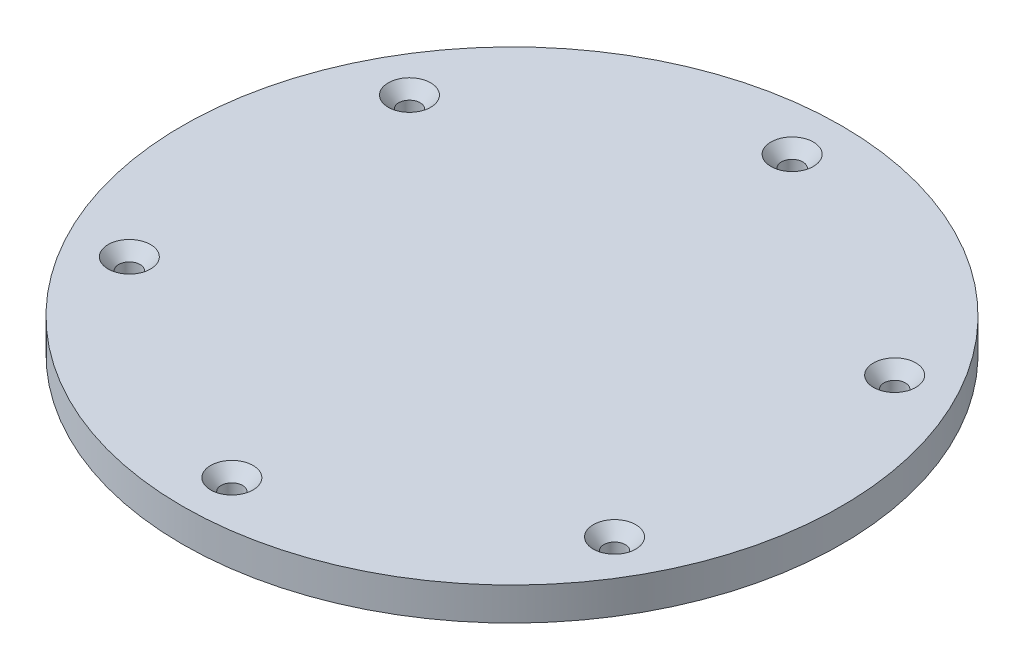
ISO-10303-21;
HEADER;
FILE_DESCRIPTION(('STEP AP214'),'2;1');
FILE_NAME('part.step','',(''),(''),'','','');
FILE_SCHEMA(('AUTOMOTIVE_DESIGN { 1 0 10303 214 1 1 1 1 }'));
ENDSEC;
DATA;
#1=APPLICATION_CONTEXT('core data for automotive mechanical design processes');
#2=APPLICATION_PROTOCOL_DEFINITION('international standard','automotive_design',2000,#1);
#3=PRODUCT_CONTEXT('',#1,'mechanical');
#4=PRODUCT('Part','Part','',(#3));
#5=PRODUCT_RELATED_PRODUCT_CATEGORY('part','',(#4));
#6=PRODUCT_DEFINITION_FORMATION('','',#4);
#7=PRODUCT_DEFINITION_CONTEXT('part definition',#1,'design');
#8=PRODUCT_DEFINITION('design','',#6,#7);
#9=PRODUCT_DEFINITION_SHAPE('','',#8);
#10=(LENGTH_UNIT() NAMED_UNIT(*) SI_UNIT(.MILLI.,.METRE.));
#11=(NAMED_UNIT(*) PLANE_ANGLE_UNIT() SI_UNIT($,.RADIAN.));
#12=(NAMED_UNIT(*) SI_UNIT($,.STERADIAN.) SOLID_ANGLE_UNIT());
#13=UNCERTAINTY_MEASURE_WITH_UNIT(LENGTH_MEASURE(1.E-05),#10,'distance_accuracy_value','');
#14=(GEOMETRIC_REPRESENTATION_CONTEXT(3) GLOBAL_UNCERTAINTY_ASSIGNED_CONTEXT((#13)) GLOBAL_UNIT_ASSIGNED_CONTEXT((#10,
#11,#12)) REPRESENTATION_CONTEXT('',''));
#15=CARTESIAN_POINT('',(0.,0.,0.));
#16=DIRECTION('',(0.,0.,1.));
#17=DIRECTION('',(1.,0.,0.));
#18=AXIS2_PLACEMENT_3D('',#15,#16,#17);
#19=CARTESIAN_POINT('',(0.,10.,0.));
#20=DIRECTION('',(0.,-1.,0.));
#21=DIRECTION('',(0.,0.,-1.));
#22=AXIS2_PLACEMENT_3D('',#19,#20,#21);
#23=CYLINDRICAL_SURFACE('',#22,100.);
#24=CARTESIAN_POINT('',(0.,10.,0.));
#25=DIRECTION('',(0.,1.,0.));
#26=DIRECTION('',(0.,0.,1.));
#27=AXIS2_PLACEMENT_3D('',#24,#25,#26);
#28=CIRCLE('',#27,100.);
#29=CARTESIAN_POINT('',(0.,10.,100.));
#30=VERTEX_POINT('',#29);
#31=EDGE_CURVE('E10',#30,#30,#28,.T.);
#32=ORIENTED_EDGE('',*,*,#31,.F.);
#33=EDGE_LOOP('',(#32));
#34=FACE_BOUND('',#33,.T.);
#35=CARTESIAN_POINT('',(0.,0.,0.));
#36=DIRECTION('',(0.,1.,0.));
#37=DIRECTION('',(0.,0.,1.));
#38=AXIS2_PLACEMENT_3D('',#35,#36,#37);
#39=CIRCLE('',#38,100.);
#40=CARTESIAN_POINT('',(0.,0.,100.));
#41=VERTEX_POINT('',#40);
#42=EDGE_CURVE('E34',#41,#41,#39,.T.);
#43=ORIENTED_EDGE('',*,*,#42,.T.);
#44=EDGE_LOOP('',(#43));
#45=FACE_BOUND('',#44,.T.);
#46=ADVANCED_FACE('F31',(#34,#45),#23,.T.);
#47=CARTESIAN_POINT('',(0.,10.,0.));
#48=DIRECTION('',(0.,1.,0.));
#49=DIRECTION('',(0.,0.,1.));
#50=AXIS2_PLACEMENT_3D('',#47,#48,#49);
#51=PLANE('',#50);
#52=CARTESIAN_POINT('',(-73.6121593216768,10.,-42.5000000000009));
#53=DIRECTION('',(0.,1.,0.));
#54=DIRECTION('',(0.,0.,1.));
#55=AXIS2_PLACEMENT_3D('',#52,#53,#54);
#56=CIRCLE('',#55,6.4389);
#57=CARTESIAN_POINT('',(-73.6121593216768,10.,-36.0611000000009));
#58=VERTEX_POINT('',#57);
#59=EDGE_CURVE('E93',#58,#58,#56,.T.);
#60=ORIENTED_EDGE('',*,*,#59,.F.);
#61=EDGE_LOOP('',(#60));
#62=FACE_BOUND('',#61,.T.);
#63=CARTESIAN_POINT('',(0.,10.,-85.));
#64=DIRECTION('',(0.,1.,0.));
#65=DIRECTION('',(0.,0.,1.));
#66=AXIS2_PLACEMENT_3D('',#63,#64,#65);
#67=CIRCLE('',#66,6.4389);
#68=CARTESIAN_POINT('',(0.,10.,-78.5611));
#69=VERTEX_POINT('',#68);
#70=EDGE_CURVE('E84',#69,#69,#67,.T.);
#71=ORIENTED_EDGE('',*,*,#70,.F.);
#72=EDGE_LOOP('',(#71));
#73=FACE_BOUND('',#72,.T.);
#74=CARTESIAN_POINT('',(73.6121593216774,10.,-42.4999999999998));
#75=DIRECTION('',(0.,1.,0.));
#76=DIRECTION('',(0.,0.,1.));
#77=AXIS2_PLACEMENT_3D('',#74,#75,#76);
#78=CIRCLE('',#77,6.4389);
#79=CARTESIAN_POINT('',(73.6121593216774,10.,-36.0610999999998));
#80=VERTEX_POINT('',#79);
#81=EDGE_CURVE('E75',#80,#80,#78,.T.);
#82=ORIENTED_EDGE('',*,*,#81,.F.);
#83=EDGE_LOOP('',(#82));
#84=FACE_BOUND('',#83,.T.);
#85=CARTESIAN_POINT('',(73.6121593216771,10.,42.5000000000003));
#86=DIRECTION('',(0.,1.,0.));
#87=DIRECTION('',(0.,0.,1.));
#88=AXIS2_PLACEMENT_3D('',#85,#86,#87);
#89=CIRCLE('',#88,6.4389);
#90=CARTESIAN_POINT('',(73.6121593216771,10.,48.9389000000003));
#91=VERTEX_POINT('',#90);
#92=EDGE_CURVE('E66',#91,#91,#89,.T.);
#93=ORIENTED_EDGE('',*,*,#92,.F.);
#94=EDGE_LOOP('',(#93));
#95=FACE_BOUND('',#94,.T.);
#96=CARTESIAN_POINT('',(0.,10.,85.));
#97=DIRECTION('',(0.,1.,0.));
#98=DIRECTION('',(0.,0.,1.));
#99=AXIS2_PLACEMENT_3D('',#96,#97,#98);
#100=CIRCLE('',#99,6.4389);
#101=CARTESIAN_POINT('',(0.,10.,91.4389));
#102=VERTEX_POINT('',#101);
#103=EDGE_CURVE('E57',#102,#102,#100,.T.);
#104=ORIENTED_EDGE('',*,*,#103,.F.);
#105=EDGE_LOOP('',(#104));
#106=FACE_BOUND('',#105,.T.);
#107=CARTESIAN_POINT('',(-73.6121593216777,10.,42.4999999999993));
#108=DIRECTION('',(0.,1.,0.));
#109=DIRECTION('',(0.,0.,1.));
#110=AXIS2_PLACEMENT_3D('',#107,#108,#109);
#111=CIRCLE('',#110,6.4389);
#112=CARTESIAN_POINT('',(-73.6121593216777,10.,48.9388999999993));
#113=VERTEX_POINT('',#112);
#114=EDGE_CURVE('E48',#113,#113,#111,.T.);
#115=ORIENTED_EDGE('',*,*,#114,.F.);
#116=EDGE_LOOP('',(#115));
#117=FACE_BOUND('',#116,.T.);
#118=ORIENTED_EDGE('',*,*,#31,.T.);
#119=EDGE_LOOP('',(#118));
#120=FACE_BOUND('',#119,.T.);
#121=ADVANCED_FACE('F99',(#62,#73,#84,#95,#106,#117,#120),#51,.T.);
#122=CARTESIAN_POINT('',(0.,0.,0.));
#123=DIRECTION('',(0.,1.,0.));
#124=DIRECTION('',(0.,0.,1.));
#125=AXIS2_PLACEMENT_3D('',#122,#123,#124);
#126=PLANE('',#125);
#127=CARTESIAN_POINT('',(-73.6121593216768,0.,-42.5000000000009));
#128=DIRECTION('',(0.,1.,0.));
#129=DIRECTION('',(0.,0.,1.));
#130=AXIS2_PLACEMENT_3D('',#127,#128,#129);
#131=CIRCLE('',#130,3.26389999999999);
#132=CARTESIAN_POINT('',(-73.6121593216768,0.,-39.2361000000009));
#133=VERTEX_POINT('',#132);
#134=EDGE_CURVE('E87',#133,#133,#131,.T.);
#135=ORIENTED_EDGE('',*,*,#134,.T.);
#136=EDGE_LOOP('',(#135));
#137=FACE_BOUND('',#136,.T.);
#138=CARTESIAN_POINT('',(0.,0.,-85.));
#139=DIRECTION('',(0.,1.,0.));
#140=DIRECTION('',(0.,0.,1.));
#141=AXIS2_PLACEMENT_3D('',#138,#139,#140);
#142=CIRCLE('',#141,3.26389999999999);
#143=CARTESIAN_POINT('',(0.,0.,-81.7361));
#144=VERTEX_POINT('',#143);
#145=EDGE_CURVE('E78',#144,#144,#142,.T.);
#146=ORIENTED_EDGE('',*,*,#145,.T.);
#147=EDGE_LOOP('',(#146));
#148=FACE_BOUND('',#147,.T.);
#149=CARTESIAN_POINT('',(73.6121593216774,0.,-42.4999999999998));
#150=DIRECTION('',(0.,1.,0.));
#151=DIRECTION('',(0.,0.,1.));
#152=AXIS2_PLACEMENT_3D('',#149,#150,#151);
#153=CIRCLE('',#152,3.26389999999999);
#154=CARTESIAN_POINT('',(73.6121593216774,0.,-39.2360999999999));
#155=VERTEX_POINT('',#154);
#156=EDGE_CURVE('E69',#155,#155,#153,.T.);
#157=ORIENTED_EDGE('',*,*,#156,.T.);
#158=EDGE_LOOP('',(#157));
#159=FACE_BOUND('',#158,.T.);
#160=CARTESIAN_POINT('',(73.6121593216771,0.,42.5000000000003));
#161=DIRECTION('',(0.,1.,0.));
#162=DIRECTION('',(0.,0.,1.));
#163=AXIS2_PLACEMENT_3D('',#160,#161,#162);
#164=CIRCLE('',#163,3.26389999999999);
#165=CARTESIAN_POINT('',(73.6121593216771,0.,45.7639000000003));
#166=VERTEX_POINT('',#165);
#167=EDGE_CURVE('E60',#166,#166,#164,.T.);
#168=ORIENTED_EDGE('',*,*,#167,.T.);
#169=EDGE_LOOP('',(#168));
#170=FACE_BOUND('',#169,.T.);
#171=CARTESIAN_POINT('',(0.,0.,85.));
#172=DIRECTION('',(0.,1.,0.));
#173=DIRECTION('',(0.,0.,1.));
#174=AXIS2_PLACEMENT_3D('',#171,#172,#173);
#175=CIRCLE('',#174,3.26389999999999);
#176=CARTESIAN_POINT('',(0.,0.,88.2639));
#177=VERTEX_POINT('',#176);
#178=EDGE_CURVE('E51',#177,#177,#175,.T.);
#179=ORIENTED_EDGE('',*,*,#178,.T.);
#180=EDGE_LOOP('',(#179));
#181=FACE_BOUND('',#180,.T.);
#182=CARTESIAN_POINT('',(-73.6121593216777,0.,42.4999999999993));
#183=DIRECTION('',(0.,1.,0.));
#184=DIRECTION('',(0.,0.,1.));
#185=AXIS2_PLACEMENT_3D('',#182,#183,#184);
#186=CIRCLE('',#185,3.26389999999999);
#187=CARTESIAN_POINT('',(-73.6121593216777,0.,45.7638999999993));
#188=VERTEX_POINT('',#187);
#189=EDGE_CURVE('E41',#188,#188,#186,.T.);
#190=ORIENTED_EDGE('',*,*,#189,.T.);
#191=EDGE_LOOP('',(#190));
#192=FACE_BOUND('',#191,.T.);
#193=ORIENTED_EDGE('',*,*,#42,.F.);
#194=EDGE_LOOP('',(#193));
#195=FACE_BOUND('',#194,.T.);
#196=ADVANCED_FACE('F102',(#137,#148,#159,#170,#181,#192,#195),#126,.F.);
#197=CARTESIAN_POINT('',(-73.6121593216777,10.,42.4999999999993));
#198=DIRECTION('',(0.,1.,0.));
#199=DIRECTION('',(0.,0.,1.));
#200=AXIS2_PLACEMENT_3D('',#197,#198,#199);
#201=CYLINDRICAL_SURFACE('',#200,3.26389999999999);
#202=ORIENTED_EDGE('',*,*,#189,.F.);
#203=EDGE_LOOP('',(#202));
#204=FACE_BOUND('',#203,.T.);
#205=CARTESIAN_POINT('',(-73.6121593216777,6.3475803070733,42.4999999999993));
#206=DIRECTION('',(0.,1.,0.));
#207=DIRECTION('',(0.,0.,1.));
#208=AXIS2_PLACEMENT_3D('',#205,#206,#207);
#209=CIRCLE('',#208,3.2639);
#210=CARTESIAN_POINT('',(-73.6121593216777,6.3475803070733,45.7638999999993));
#211=VERTEX_POINT('',#210);
#212=EDGE_CURVE('E45',#211,#211,#209,.T.);
#213=ORIENTED_EDGE('',*,*,#212,.T.);
#214=EDGE_LOOP('',(#213));
#215=FACE_BOUND('',#214,.T.);
#216=ADVANCED_FACE('F117',(#204,#215),#201,.F.);
#217=CARTESIAN_POINT('',(-73.6121593216777,10.,42.4999999999993));
#218=DIRECTION('',(0.,1.,0.));
#219=DIRECTION('',(0.,0.,1.));
#220=AXIS2_PLACEMENT_3D('',#217,#218,#219);
#221=CONICAL_SURFACE('',#220,6.4389,0.715584993317675);
#222=ORIENTED_EDGE('',*,*,#212,.F.);
#223=EDGE_LOOP('',(#222));
#224=FACE_BOUND('',#223,.T.);
#225=ORIENTED_EDGE('',*,*,#114,.T.);
#226=EDGE_LOOP('',(#225));
#227=FACE_BOUND('',#226,.T.);
#228=ADVANCED_FACE('F114',(#224,#227),#221,.F.);
#229=CARTESIAN_POINT('',(0.,10.,85.));
#230=DIRECTION('',(0.,1.,0.));
#231=DIRECTION('',(0.,0.,1.));
#232=AXIS2_PLACEMENT_3D('',#229,#230,#231);
#233=CYLINDRICAL_SURFACE('',#232,3.26389999999999);
#234=ORIENTED_EDGE('',*,*,#178,.F.);
#235=EDGE_LOOP('',(#234));
#236=FACE_BOUND('',#235,.T.);
#237=CARTESIAN_POINT('',(0.,6.3475803070733,85.));
#238=DIRECTION('',(0.,1.,0.));
#239=DIRECTION('',(0.,0.,1.));
#240=AXIS2_PLACEMENT_3D('',#237,#238,#239);
#241=CIRCLE('',#240,3.2639);
#242=CARTESIAN_POINT('',(0.,6.3475803070733,88.2639));
#243=VERTEX_POINT('',#242);
#244=EDGE_CURVE('E54',#243,#243,#241,.T.);
#245=ORIENTED_EDGE('',*,*,#244,.T.);
#246=EDGE_LOOP('',(#245));
#247=FACE_BOUND('',#246,.T.);
#248=ADVANCED_FACE('F116',(#236,#247),#233,.F.);
#249=CARTESIAN_POINT('',(0.,10.,85.));
#250=DIRECTION('',(0.,1.,0.));
#251=DIRECTION('',(0.,0.,1.));
#252=AXIS2_PLACEMENT_3D('',#249,#250,#251);
#253=CONICAL_SURFACE('',#252,6.4389,0.715584993317676);
#254=ORIENTED_EDGE('',*,*,#244,.F.);
#255=EDGE_LOOP('',(#254));
#256=FACE_BOUND('',#255,.T.);
#257=ORIENTED_EDGE('',*,*,#103,.T.);
#258=EDGE_LOOP('',(#257));
#259=FACE_BOUND('',#258,.T.);
#260=ADVANCED_FACE('F124',(#256,#259),#253,.F.);
#261=CARTESIAN_POINT('',(73.6121593216771,10.,42.5000000000003));
#262=DIRECTION('',(0.,1.,0.));
#263=DIRECTION('',(0.,0.,1.));
#264=AXIS2_PLACEMENT_3D('',#261,#262,#263);
#265=CYLINDRICAL_SURFACE('',#264,3.26389999999999);
#266=ORIENTED_EDGE('',*,*,#167,.F.);
#267=EDGE_LOOP('',(#266));
#268=FACE_BOUND('',#267,.T.);
#269=CARTESIAN_POINT('',(73.6121593216771,6.3475803070733,42.5000000000003));
#270=DIRECTION('',(0.,1.,0.));
#271=DIRECTION('',(0.,0.,1.));
#272=AXIS2_PLACEMENT_3D('',#269,#270,#271);
#273=CIRCLE('',#272,3.2639);
#274=CARTESIAN_POINT('',(73.6121593216771,6.3475803070733,45.7639000000003));
#275=VERTEX_POINT('',#274);
#276=EDGE_CURVE('E63',#275,#275,#273,.T.);
#277=ORIENTED_EDGE('',*,*,#276,.T.);
#278=EDGE_LOOP('',(#277));
#279=FACE_BOUND('',#278,.T.);
#280=ADVANCED_FACE('F158',(#268,#279),#265,.F.);
#281=CARTESIAN_POINT('',(73.6121593216771,10.,42.5000000000003));
#282=DIRECTION('',(0.,1.,0.));
#283=DIRECTION('',(0.,0.,1.));
#284=AXIS2_PLACEMENT_3D('',#281,#282,#283);
#285=CONICAL_SURFACE('',#284,6.4389,0.715584993317675);
#286=ORIENTED_EDGE('',*,*,#276,.F.);
#287=EDGE_LOOP('',(#286));
#288=FACE_BOUND('',#287,.T.);
#289=ORIENTED_EDGE('',*,*,#92,.T.);
#290=EDGE_LOOP('',(#289));
#291=FACE_BOUND('',#290,.T.);
#292=ADVANCED_FACE('F163',(#288,#291),#285,.F.);
#293=CARTESIAN_POINT('',(73.6121593216774,10.,-42.4999999999998));
#294=DIRECTION('',(0.,1.,0.));
#295=DIRECTION('',(0.,0.,1.));
#296=AXIS2_PLACEMENT_3D('',#293,#294,#295);
#297=CYLINDRICAL_SURFACE('',#296,3.26389999999999);
#298=ORIENTED_EDGE('',*,*,#156,.F.);
#299=EDGE_LOOP('',(#298));
#300=FACE_BOUND('',#299,.T.);
#301=CARTESIAN_POINT('',(73.6121593216774,6.3475803070733,-42.4999999999998));
#302=DIRECTION('',(0.,1.,0.));
#303=DIRECTION('',(0.,0.,1.));
#304=AXIS2_PLACEMENT_3D('',#301,#302,#303);
#305=CIRCLE('',#304,3.2639);
#306=CARTESIAN_POINT('',(73.6121593216774,6.3475803070733,-39.2360999999998));
#307=VERTEX_POINT('',#306);
#308=EDGE_CURVE('E72',#307,#307,#305,.T.);
#309=ORIENTED_EDGE('',*,*,#308,.T.);
#310=EDGE_LOOP('',(#309));
#311=FACE_BOUND('',#310,.T.);
#312=ADVANCED_FACE('F169',(#300,#311),#297,.F.);
#313=CARTESIAN_POINT('',(73.6121593216774,10.,-42.4999999999998));
#314=DIRECTION('',(0.,1.,0.));
#315=DIRECTION('',(0.,0.,1.));
#316=AXIS2_PLACEMENT_3D('',#313,#314,#315);
#317=CONICAL_SURFACE('',#316,6.4389,0.715584993317675);
#318=ORIENTED_EDGE('',*,*,#308,.F.);
#319=EDGE_LOOP('',(#318));
#320=FACE_BOUND('',#319,.T.);
#321=ORIENTED_EDGE('',*,*,#81,.T.);
#322=EDGE_LOOP('',(#321));
#323=FACE_BOUND('',#322,.T.);
#324=ADVANCED_FACE('F173',(#320,#323),#317,.F.);
#325=CARTESIAN_POINT('',(0.,10.,-85.));
#326=DIRECTION('',(0.,1.,0.));
#327=DIRECTION('',(0.,0.,1.));
#328=AXIS2_PLACEMENT_3D('',#325,#326,#327);
#329=CYLINDRICAL_SURFACE('',#328,3.26389999999999);
#330=ORIENTED_EDGE('',*,*,#145,.F.);
#331=EDGE_LOOP('',(#330));
#332=FACE_BOUND('',#331,.T.);
#333=CARTESIAN_POINT('',(0.,6.3475803070733,-85.));
#334=DIRECTION('',(0.,1.,0.));
#335=DIRECTION('',(0.,0.,1.));
#336=AXIS2_PLACEMENT_3D('',#333,#334,#335);
#337=CIRCLE('',#336,3.2639);
#338=CARTESIAN_POINT('',(0.,6.3475803070733,-81.7361));
#339=VERTEX_POINT('',#338);
#340=EDGE_CURVE('E81',#339,#339,#337,.T.);
#341=ORIENTED_EDGE('',*,*,#340,.T.);
#342=EDGE_LOOP('',(#341));
#343=FACE_BOUND('',#342,.T.);
#344=ADVANCED_FACE('F177',(#332,#343),#329,.F.);
#345=CARTESIAN_POINT('',(0.,10.,-85.));
#346=DIRECTION('',(0.,1.,0.));
#347=DIRECTION('',(0.,0.,1.));
#348=AXIS2_PLACEMENT_3D('',#345,#346,#347);
#349=CONICAL_SURFACE('',#348,6.4389,0.715584993317676);
#350=ORIENTED_EDGE('',*,*,#340,.F.);
#351=EDGE_LOOP('',(#350));
#352=FACE_BOUND('',#351,.T.);
#353=ORIENTED_EDGE('',*,*,#70,.T.);
#354=EDGE_LOOP('',(#353));
#355=FACE_BOUND('',#354,.T.);
#356=ADVANCED_FACE('F181',(#352,#355),#349,.F.);
#357=CARTESIAN_POINT('',(-73.6121593216768,10.,-42.5000000000009));
#358=DIRECTION('',(0.,1.,0.));
#359=DIRECTION('',(0.,0.,1.));
#360=AXIS2_PLACEMENT_3D('',#357,#358,#359);
#361=CYLINDRICAL_SURFACE('',#360,3.26389999999999);
#362=ORIENTED_EDGE('',*,*,#134,.F.);
#363=EDGE_LOOP('',(#362));
#364=FACE_BOUND('',#363,.T.);
#365=CARTESIAN_POINT('',(-73.6121593216768,6.3475803070733,-42.5000000000009));
#366=DIRECTION('',(0.,1.,0.));
#367=DIRECTION('',(0.,0.,1.));
#368=AXIS2_PLACEMENT_3D('',#365,#366,#367);
#369=CIRCLE('',#368,3.2639);
#370=CARTESIAN_POINT('',(-73.6121593216768,6.3475803070733,-39.2361000000009));
#371=VERTEX_POINT('',#370);
#372=EDGE_CURVE('E90',#371,#371,#369,.T.);
#373=ORIENTED_EDGE('',*,*,#372,.T.);
#374=EDGE_LOOP('',(#373));
#375=FACE_BOUND('',#374,.T.);
#376=ADVANCED_FACE('F185',(#364,#375),#361,.F.);
#377=CARTESIAN_POINT('',(-73.6121593216768,10.,-42.5000000000009));
#378=DIRECTION('',(0.,1.,0.));
#379=DIRECTION('',(0.,0.,1.));
#380=AXIS2_PLACEMENT_3D('',#377,#378,#379);
#381=CONICAL_SURFACE('',#380,6.4389,0.715584993317675);
#382=ORIENTED_EDGE('',*,*,#372,.F.);
#383=EDGE_LOOP('',(#382));
#384=FACE_BOUND('',#383,.T.);
#385=ORIENTED_EDGE('',*,*,#59,.T.);
#386=EDGE_LOOP('',(#385));
#387=FACE_BOUND('',#386,.T.);
#388=ADVANCED_FACE('F97',(#384,#387),#381,.F.);
#389=CLOSED_SHELL('',(#46,#121,#196,#216,#228,#248,#260,#280,#292,#312,#324,#344,#356,#376,#388));
#390=MANIFOLD_SOLID_BREP('B2',#389);
#391=ADVANCED_BREP_SHAPE_REPRESENTATION('',(#18,#390),#14);
#392=SHAPE_DEFINITION_REPRESENTATION(#9,#391);
ENDSEC;
END-ISO-10303-21;
